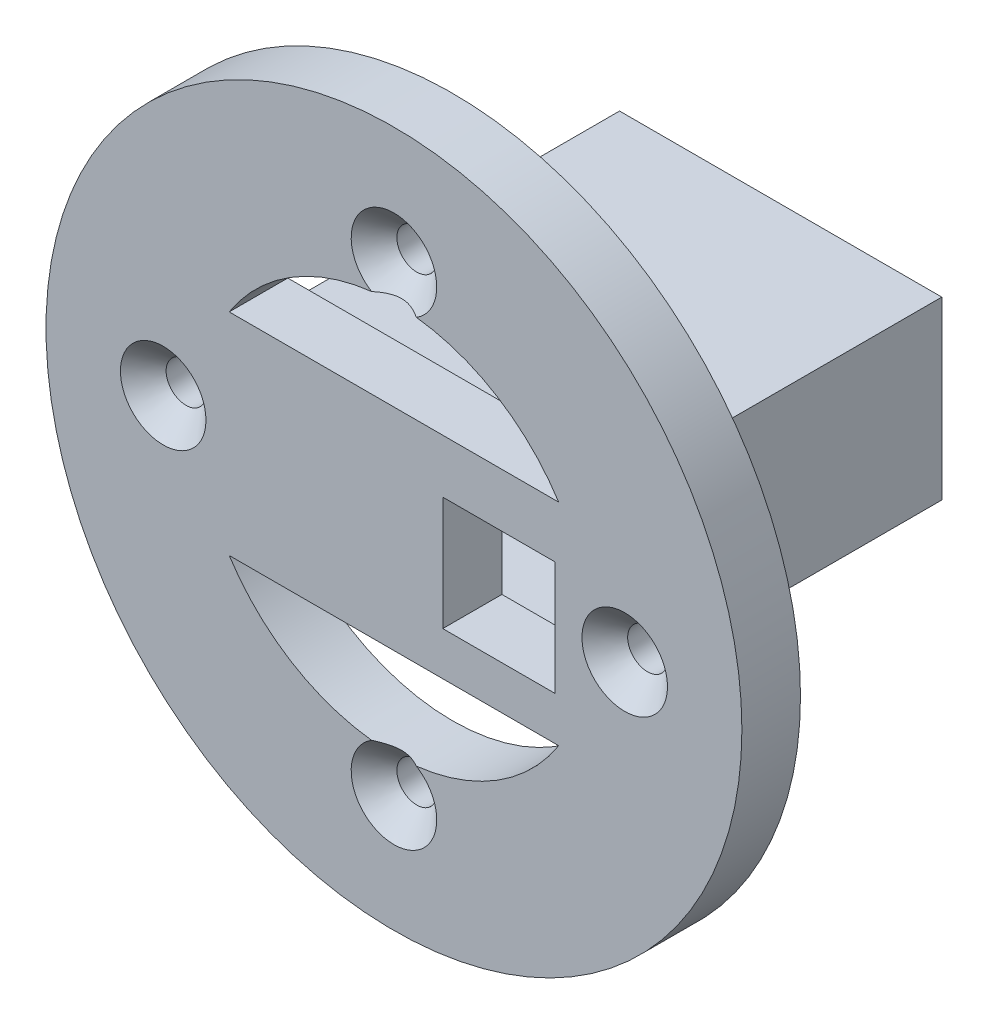
ISO-10303-21;
HEADER;
FILE_DESCRIPTION(('STEP AP214'),'2;1');
FILE_NAME('part.step','',(''),(''),'','','');
FILE_SCHEMA(('AUTOMOTIVE_DESIGN { 1 0 10303 214 1 1 1 1 }'));
ENDSEC;
DATA;
#1=APPLICATION_CONTEXT('core data for automotive mechanical design processes');
#2=APPLICATION_PROTOCOL_DEFINITION('international standard','automotive_design',2000,#1);
#3=PRODUCT_CONTEXT('',#1,'mechanical');
#4=PRODUCT('Part','Part','',(#3));
#5=PRODUCT_RELATED_PRODUCT_CATEGORY('part','',(#4));
#6=PRODUCT_DEFINITION_FORMATION('','',#4);
#7=PRODUCT_DEFINITION_CONTEXT('part definition',#1,'design');
#8=PRODUCT_DEFINITION('design','',#6,#7);
#9=PRODUCT_DEFINITION_SHAPE('','',#8);
#10=(LENGTH_UNIT() NAMED_UNIT(*) SI_UNIT(.MILLI.,.METRE.));
#11=(NAMED_UNIT(*) PLANE_ANGLE_UNIT() SI_UNIT($,.RADIAN.));
#12=(NAMED_UNIT(*) SI_UNIT($,.STERADIAN.) SOLID_ANGLE_UNIT());
#13=UNCERTAINTY_MEASURE_WITH_UNIT(LENGTH_MEASURE(1.E-05),#10,'distance_accuracy_value','');
#14=(GEOMETRIC_REPRESENTATION_CONTEXT(3) GLOBAL_UNCERTAINTY_ASSIGNED_CONTEXT((#13)) GLOBAL_UNIT_ASSIGNED_CONTEXT((#10,
#11,#12)) REPRESENTATION_CONTEXT('',''));
#15=CARTESIAN_POINT('',(0.,0.,0.));
#16=DIRECTION('',(0.,0.,1.));
#17=DIRECTION('',(1.,0.,0.));
#18=AXIS2_PLACEMENT_3D('',#15,#16,#17);
#19=CARTESIAN_POINT('',(13.75,7.5,0.));
#20=DIRECTION('',(-1.,0.,0.));
#21=DIRECTION('',(0.,0.,1.));
#22=AXIS2_PLACEMENT_3D('',#19,#20,#21);
#23=PLANE('',#22);
#24=DIRECTION('',(0.,0.,1.));
#25=VECTOR('',#24,1.);
#26=CARTESIAN_POINT('',(13.75,-5.29266234845059,-13.6995729837994));
#27=LINE('',#26,#25);
#28=CARTESIAN_POINT('',(13.75,-5.29266234845059,-0.050000000000005));
#29=VERTEX_POINT('',#28);
#30=CARTESIAN_POINT('',(13.75,-5.29266234845059,0.));
#31=VERTEX_POINT('',#30);
#32=EDGE_CURVE('E228',#29,#31,#27,.T.);
#33=ORIENTED_EDGE('',*,*,#32,.T.);
#34=DIRECTION('',(0.,-1.,0.));
#35=VECTOR('',#34,1.);
#36=CARTESIAN_POINT('',(13.75,7.5,0.));
#37=LINE('',#36,#35);
#38=CARTESIAN_POINT('',(13.75,-7.5,0.));
#39=VERTEX_POINT('',#38);
#40=EDGE_CURVE('E322',#31,#39,#37,.T.);
#41=ORIENTED_EDGE('',*,*,#40,.T.);
#42=DIRECTION('',(0.,0.,-1.));
#43=VECTOR('',#42,1.);
#44=CARTESIAN_POINT('',(13.75,-7.5,0.));
#45=LINE('',#44,#43);
#46=CARTESIAN_POINT('',(13.75,-7.5,-28.));
#47=VERTEX_POINT('',#46);
#48=EDGE_CURVE('E314',#39,#47,#45,.T.);
#49=ORIENTED_EDGE('',*,*,#48,.T.);
#50=DIRECTION('',(0.,-1.,0.));
#51=VECTOR('',#50,1.);
#52=CARTESIAN_POINT('',(13.75,7.5,-28.));
#53=LINE('',#52,#51);
#54=CARTESIAN_POINT('',(13.75,7.5,-28.));
#55=VERTEX_POINT('',#54);
#56=EDGE_CURVE('E319',#55,#47,#53,.T.);
#57=ORIENTED_EDGE('',*,*,#56,.F.);
#58=DIRECTION('',(0.,0.,-1.));
#59=VECTOR('',#58,1.);
#60=CARTESIAN_POINT('',(13.75,7.5,0.));
#61=LINE('',#60,#59);
#62=CARTESIAN_POINT('',(13.75,7.5,0.));
#63=VERTEX_POINT('',#62);
#64=EDGE_CURVE('E304',#63,#55,#61,.T.);
#65=ORIENTED_EDGE('',*,*,#64,.F.);
#66=CARTESIAN_POINT('',(13.75,4.42501278313102,0.));
#67=VERTEX_POINT('',#66);
#68=EDGE_CURVE('E323',#63,#67,#37,.T.);
#69=ORIENTED_EDGE('',*,*,#68,.T.);
#70=DIRECTION('',(0.,0.,1.));
#71=VECTOR('',#70,1.);
#72=CARTESIAN_POINT('',(13.75,4.42501278313102,-13.6995729837994));
#73=LINE('',#72,#71);
#74=CARTESIAN_POINT('',(13.75,4.42501278313102,-0.0500000000000049));
#75=VERTEX_POINT('',#74);
#76=EDGE_CURVE('E211',#75,#67,#73,.T.);
#77=ORIENTED_EDGE('',*,*,#76,.F.);
#78=DIRECTION('',(0.,-1.,0.));
#79=VECTOR('',#78,1.);
#80=CARTESIAN_POINT('',(13.75,-5.29266234845059,-0.0500000000000049));
#81=LINE('',#80,#79);
#82=EDGE_CURVE('E685',#75,#29,#81,.T.);
#83=ORIENTED_EDGE('',*,*,#82,.T.);
#84=EDGE_LOOP('',(#33,#41,#49,#57,#65,#69,#77,#83));
#85=FACE_BOUND('',#84,.T.);
#86=ADVANCED_FACE('F41',(#85),#23,.F.);
#87=CARTESIAN_POINT('',(-11.75,-6.1,-25.5));
#88=DIRECTION('',(0.,0.,1.));
#89=DIRECTION('',(1.,0.,0.));
#90=AXIS2_PLACEMENT_3D('',#87,#88,#89);
#91=PLANE('',#90);
#92=DIRECTION('',(0.,1.,0.));
#93=VECTOR('',#92,1.);
#94=CARTESIAN_POINT('',(11.75,-6.1,-25.5));
#95=LINE('',#94,#93);
#96=CARTESIAN_POINT('',(11.75,-6.1,-25.5));
#97=VERTEX_POINT('',#96);
#98=CARTESIAN_POINT('',(11.75,-5.5,-25.5));
#99=VERTEX_POINT('',#98);
#100=EDGE_CURVE('E292',#97,#99,#95,.T.);
#101=ORIENTED_EDGE('',*,*,#100,.T.);
#102=DIRECTION('',(-1.,0.,0.));
#103=VECTOR('',#102,1.);
#104=CARTESIAN_POINT('',(-11.75,-5.5,-25.5));
#105=LINE('',#104,#103);
#106=CARTESIAN_POINT('',(5.75000000000001,-5.5,-25.5));
#107=VERTEX_POINT('',#106);
#108=EDGE_CURVE('E261',#99,#107,#105,.T.);
#109=ORIENTED_EDGE('',*,*,#108,.T.);
#110=DIRECTION('',(0.,1.,0.));
#111=VECTOR('',#110,1.);
#112=CARTESIAN_POINT('',(5.75000000000001,-6.1,-25.5));
#113=LINE('',#112,#111);
#114=CARTESIAN_POINT('',(5.75000000000001,5.5,-25.5));
#115=VERTEX_POINT('',#114);
#116=EDGE_CURVE('E11',#107,#115,#113,.T.);
#117=ORIENTED_EDGE('',*,*,#116,.T.);
#118=DIRECTION('',(-1.,0.,0.));
#119=VECTOR('',#118,1.);
#120=CARTESIAN_POINT('',(-11.75,5.5,-25.5));
#121=LINE('',#120,#119);
#122=CARTESIAN_POINT('',(11.75,5.5,-25.5));
#123=VERTEX_POINT('',#122);
#124=EDGE_CURVE('E259',#123,#115,#121,.T.);
#125=ORIENTED_EDGE('',*,*,#124,.F.);
#126=CARTESIAN_POINT('',(11.75,6.1,-25.5));
#127=VERTEX_POINT('',#126);
#128=EDGE_CURVE('E295',#123,#127,#95,.T.);
#129=ORIENTED_EDGE('',*,*,#128,.T.);
#130=DIRECTION('',(1.,0.,0.));
#131=VECTOR('',#130,1.);
#132=CARTESIAN_POINT('',(-11.75,6.1,-25.5));
#133=LINE('',#132,#131);
#134=CARTESIAN_POINT('',(-11.75,6.1,-25.5));
#135=VERTEX_POINT('',#134);
#136=EDGE_CURVE('E282',#135,#127,#133,.T.);
#137=ORIENTED_EDGE('',*,*,#136,.F.);
#138=DIRECTION('',(0.,1.,0.));
#139=VECTOR('',#138,1.);
#140=CARTESIAN_POINT('',(-11.75,-6.1,-25.5));
#141=LINE('',#140,#139);
#142=CARTESIAN_POINT('',(-11.75,-6.1,-25.5));
#143=VERTEX_POINT('',#142);
#144=EDGE_CURVE('E289',#143,#135,#141,.T.);
#145=ORIENTED_EDGE('',*,*,#144,.F.);
#146=DIRECTION('',(1.,0.,0.));
#147=VECTOR('',#146,1.);
#148=CARTESIAN_POINT('',(-11.75,-6.1,-25.5));
#149=LINE('',#148,#147);
#150=EDGE_CURVE('E272',#143,#97,#149,.T.);
#151=ORIENTED_EDGE('',*,*,#150,.T.);
#152=EDGE_LOOP('',(#101,#109,#117,#125,#129,#137,#145,#151));
#153=FACE_BOUND('',#152,.T.);
#154=ADVANCED_FACE('F454',(#153),#91,.T.);
#155=CARTESIAN_POINT('',(-11.75,-6.1,-0.0500000000000036));
#156=DIRECTION('',(0.,0.,1.));
#157=DIRECTION('',(1.,0.,0.));
#158=AXIS2_PLACEMENT_3D('',#155,#156,#157);
#159=PLANE('',#158);
#160=DIRECTION('',(0.,-1.,0.));
#161=VECTOR('',#160,1.);
#162=CARTESIAN_POINT('',(4.16471791353497,-5.29266234845059,-0.0500000000000049));
#163=LINE('',#162,#161);
#164=CARTESIAN_POINT('',(4.16471791353497,4.42501278313102,-0.0500000000000049));
#165=VERTEX_POINT('',#164);
#166=CARTESIAN_POINT('',(4.16471791353497,-5.29266234845059,-0.0500000000000049));
#167=VERTEX_POINT('',#166);
#168=EDGE_CURVE('E208',#165,#167,#163,.T.);
#169=ORIENTED_EDGE('',*,*,#168,.T.);
#170=DIRECTION('',(1.,0.,0.));
#171=VECTOR('',#170,1.);
#172=CARTESIAN_POINT('',(13.75,-5.29266234845059,-0.0500000000000049));
#173=LINE('',#172,#171);
#174=CARTESIAN_POINT('',(11.75,-5.29266234845059,-0.0500000000000048));
#175=VERTEX_POINT('',#174);
#176=EDGE_CURVE('E678',#167,#175,#173,.T.);
#177=ORIENTED_EDGE('',*,*,#176,.T.);
#178=DIRECTION('',(0.,1.,0.));
#179=VECTOR('',#178,1.);
#180=CARTESIAN_POINT('',(11.75,-6.1,-0.0500000000000049));
#181=LINE('',#180,#179);
#182=CARTESIAN_POINT('',(11.75,-6.1,-0.0500000000000049));
#183=VERTEX_POINT('',#182);
#184=EDGE_CURVE('E296',#183,#175,#181,.T.);
#185=ORIENTED_EDGE('',*,*,#184,.F.);
#186=DIRECTION('',(1.,0.,0.));
#187=VECTOR('',#186,1.);
#188=CARTESIAN_POINT('',(-11.75,-6.1,-0.0500000000000036));
#189=LINE('',#188,#187);
#190=CARTESIAN_POINT('',(-11.75,-6.1,-0.0500000000000036));
#191=VERTEX_POINT('',#190);
#192=EDGE_CURVE('E265',#191,#183,#189,.T.);
#193=ORIENTED_EDGE('',*,*,#192,.F.);
#194=DIRECTION('',(0.,1.,0.));
#195=VECTOR('',#194,1.);
#196=CARTESIAN_POINT('',(-11.75,-6.1,-0.0500000000000036));
#197=LINE('',#196,#195);
#198=CARTESIAN_POINT('',(-11.75,6.1,-0.0500000000000036));
#199=VERTEX_POINT('',#198);
#200=EDGE_CURVE('E286',#191,#199,#197,.T.);
#201=ORIENTED_EDGE('',*,*,#200,.T.);
#202=DIRECTION('',(1.,0.,0.));
#203=VECTOR('',#202,1.);
#204=CARTESIAN_POINT('',(-11.75,6.1,-0.0500000000000036));
#205=LINE('',#204,#203);
#206=CARTESIAN_POINT('',(11.75,6.1,-0.0500000000000049));
#207=VERTEX_POINT('',#206);
#208=EDGE_CURVE('E264',#199,#207,#205,.T.);
#209=ORIENTED_EDGE('',*,*,#208,.T.);
#210=CARTESIAN_POINT('',(11.75,4.42501278313102,-0.0500000000000048));
#211=VERTEX_POINT('',#210);
#212=EDGE_CURVE('E276',#211,#207,#181,.T.);
#213=ORIENTED_EDGE('',*,*,#212,.F.);
#214=DIRECTION('',(1.,0.,0.));
#215=VECTOR('',#214,1.);
#216=CARTESIAN_POINT('',(13.75,4.42501278313102,-0.0500000000000049));
#217=LINE('',#216,#215);
#218=EDGE_CURVE('E234',#165,#211,#217,.T.);
#219=ORIENTED_EDGE('',*,*,#218,.F.);
#220=EDGE_LOOP('',(#169,#177,#185,#193,#201,#209,#213,#219));
#221=FACE_BOUND('',#220,.T.);
#222=ADVANCED_FACE('F462',(#221),#159,.F.);
#223=CARTESIAN_POINT('',(-11.75,-6.1,-0.0500000000000036));
#224=DIRECTION('',(1.,0.,0.));
#225=DIRECTION('',(0.,0.,-1.));
#226=AXIS2_PLACEMENT_3D('',#223,#224,#225);
#227=PLANE('',#226);
#228=DIRECTION('',(0.,0.,-1.));
#229=VECTOR('',#228,1.);
#230=CARTESIAN_POINT('',(-11.75,6.1,-0.0500000000000036));
#231=LINE('',#230,#229);
#232=EDGE_CURVE('E269',#199,#135,#231,.T.);
#233=ORIENTED_EDGE('',*,*,#232,.F.);
#234=ORIENTED_EDGE('',*,*,#200,.F.);
#235=DIRECTION('',(0.,0.,-1.));
#236=VECTOR('',#235,1.);
#237=CARTESIAN_POINT('',(-11.75,-6.1,-0.0500000000000036));
#238=LINE('',#237,#236);
#239=EDGE_CURVE('E274',#191,#143,#238,.T.);
#240=ORIENTED_EDGE('',*,*,#239,.T.);
#241=ORIENTED_EDGE('',*,*,#144,.T.);
#242=EDGE_LOOP('',(#233,#234,#240,#241));
#243=FACE_BOUND('',#242,.T.);
#244=ADVANCED_FACE('F527',(#243),#227,.T.);
#245=CARTESIAN_POINT('',(11.75,-6.1,-0.0500000000000049));
#246=DIRECTION('',(1.,0.,0.));
#247=DIRECTION('',(0.,0.,-1.));
#248=AXIS2_PLACEMENT_3D('',#245,#246,#247);
#249=PLANE('',#248);
#250=ORIENTED_EDGE('',*,*,#128,.F.);
#251=DIRECTION('',(0.,0.,-1.));
#252=VECTOR('',#251,1.);
#253=CARTESIAN_POINT('',(11.75,5.5,-25.));
#254=LINE('',#253,#252);
#255=CARTESIAN_POINT('',(11.75,5.5,-28.));
#256=VERTEX_POINT('',#255);
#257=EDGE_CURVE('E253',#123,#256,#254,.T.);
#258=ORIENTED_EDGE('',*,*,#257,.T.);
#259=DIRECTION('',(0.,-1.,0.));
#260=VECTOR('',#259,1.);
#261=CARTESIAN_POINT('',(11.75,5.5,-28.));
#262=LINE('',#261,#260);
#263=CARTESIAN_POINT('',(11.75,-5.5,-28.));
#264=VERTEX_POINT('',#263);
#265=EDGE_CURVE('E244',#256,#264,#262,.T.);
#266=ORIENTED_EDGE('',*,*,#265,.T.);
#267=DIRECTION('',(0.,0.,-1.));
#268=VECTOR('',#267,1.);
#269=CARTESIAN_POINT('',(11.75,-5.5,-25.));
#270=LINE('',#269,#268);
#271=EDGE_CURVE('E255',#99,#264,#270,.T.);
#272=ORIENTED_EDGE('',*,*,#271,.F.);
#273=ORIENTED_EDGE('',*,*,#100,.F.);
#274=DIRECTION('',(0.,0.,-1.));
#275=VECTOR('',#274,1.);
#276=CARTESIAN_POINT('',(11.75,-6.1,-0.0500000000000049));
#277=LINE('',#276,#275);
#278=EDGE_CURVE('E268',#183,#97,#277,.T.);
#279=ORIENTED_EDGE('',*,*,#278,.F.);
#280=ORIENTED_EDGE('',*,*,#184,.T.);
#281=EDGE_CURVE('E236',#175,#211,#181,.T.);
#282=ORIENTED_EDGE('',*,*,#281,.T.);
#283=ORIENTED_EDGE('',*,*,#212,.T.);
#284=DIRECTION('',(0.,0.,-1.));
#285=VECTOR('',#284,1.);
#286=CARTESIAN_POINT('',(11.75,6.1,-0.0500000000000049));
#287=LINE('',#286,#285);
#288=EDGE_CURVE('E279',#207,#127,#287,.T.);
#289=ORIENTED_EDGE('',*,*,#288,.T.);
#290=EDGE_LOOP('',(#250,#258,#266,#272,#273,#279,#280,#282,#283,#289));
#291=FACE_BOUND('',#290,.T.);
#292=ADVANCED_FACE('F531',(#291),#249,.F.);
#293=CARTESIAN_POINT('',(0.,-6.1,0.));
#294=DIRECTION('',(0.,1.,0.));
#295=DIRECTION('',(0.,0.,1.));
#296=AXIS2_PLACEMENT_3D('',#293,#294,#295);
#297=PLANE('',#296);
#298=ORIENTED_EDGE('',*,*,#192,.T.);
#299=ORIENTED_EDGE('',*,*,#278,.T.);
#300=ORIENTED_EDGE('',*,*,#150,.F.);
#301=ORIENTED_EDGE('',*,*,#239,.F.);
#302=EDGE_LOOP('',(#298,#299,#300,#301));
#303=FACE_BOUND('',#302,.T.);
#304=ADVANCED_FACE('F538',(#303),#297,.T.);
#305=CARTESIAN_POINT('',(0.,6.1,0.));
#306=DIRECTION('',(0.,1.,0.));
#307=DIRECTION('',(0.,0.,1.));
#308=AXIS2_PLACEMENT_3D('',#305,#306,#307);
#309=PLANE('',#308);
#310=ORIENTED_EDGE('',*,*,#208,.F.);
#311=ORIENTED_EDGE('',*,*,#232,.T.);
#312=ORIENTED_EDGE('',*,*,#136,.T.);
#313=ORIENTED_EDGE('',*,*,#288,.F.);
#314=EDGE_LOOP('',(#310,#311,#312,#313));
#315=FACE_BOUND('',#314,.T.);
#316=ADVANCED_FACE('F542',(#315),#309,.F.);
#317=CARTESIAN_POINT('',(5.75000000000001,5.5,-25.));
#318=DIRECTION('',(1.,0.,0.));
#319=DIRECTION('',(0.,1.,0.));
#320=AXIS2_PLACEMENT_3D('',#317,#318,#319);
#321=PLANE('',#320);
#322=DIRECTION('',(0.,0.,-1.));
#323=VECTOR('',#322,1.);
#324=CARTESIAN_POINT('',(5.75000000000001,-5.5,-25.));
#325=LINE('',#324,#323);
#326=CARTESIAN_POINT('',(5.75000000000001,-5.5,-28.));
#327=VERTEX_POINT('',#326);
#328=EDGE_CURVE('E257',#107,#327,#325,.T.);
#329=ORIENTED_EDGE('',*,*,#328,.T.);
#330=DIRECTION('',(0.,-1.,0.));
#331=VECTOR('',#330,1.);
#332=CARTESIAN_POINT('',(5.75000000000001,5.5,-28.));
#333=LINE('',#332,#331);
#334=CARTESIAN_POINT('',(5.75000000000001,5.5,-28.));
#335=VERTEX_POINT('',#334);
#336=EDGE_CURVE('E238',#335,#327,#333,.T.);
#337=ORIENTED_EDGE('',*,*,#336,.F.);
#338=DIRECTION('',(0.,0.,-1.));
#339=VECTOR('',#338,1.);
#340=CARTESIAN_POINT('',(5.75000000000001,5.5,-25.));
#341=LINE('',#340,#339);
#342=EDGE_CURVE('E250',#115,#335,#341,.T.);
#343=ORIENTED_EDGE('',*,*,#342,.F.);
#344=ORIENTED_EDGE('',*,*,#116,.F.);
#345=EDGE_LOOP('',(#329,#337,#343,#344));
#346=FACE_BOUND('',#345,.T.);
#347=ADVANCED_FACE('F550',(#346),#321,.T.);
#348=CARTESIAN_POINT('',(5.75000000000001,-5.5,-25.));
#349=DIRECTION('',(0.,1.,0.));
#350=DIRECTION('',(-1.,0.,0.));
#351=AXIS2_PLACEMENT_3D('',#348,#349,#350);
#352=PLANE('',#351);
#353=ORIENTED_EDGE('',*,*,#271,.T.);
#354=DIRECTION('',(1.,0.,0.));
#355=VECTOR('',#354,1.);
#356=CARTESIAN_POINT('',(5.75000000000001,-5.5,-28.));
#357=LINE('',#356,#355);
#358=EDGE_CURVE('E241',#327,#264,#357,.T.);
#359=ORIENTED_EDGE('',*,*,#358,.F.);
#360=ORIENTED_EDGE('',*,*,#328,.F.);
#361=ORIENTED_EDGE('',*,*,#108,.F.);
#362=EDGE_LOOP('',(#353,#359,#360,#361));
#363=FACE_BOUND('',#362,.T.);
#364=ADVANCED_FACE('F565',(#363),#352,.T.);
#365=CARTESIAN_POINT('',(5.75000000000001,5.5,-25.));
#366=DIRECTION('',(0.,1.,0.));
#367=DIRECTION('',(-1.,0.,0.));
#368=AXIS2_PLACEMENT_3D('',#365,#366,#367);
#369=PLANE('',#368);
#370=ORIENTED_EDGE('',*,*,#124,.T.);
#371=ORIENTED_EDGE('',*,*,#342,.T.);
#372=DIRECTION('',(1.,0.,0.));
#373=VECTOR('',#372,1.);
#374=CARTESIAN_POINT('',(5.75000000000001,5.5,-28.));
#375=LINE('',#374,#373);
#376=EDGE_CURVE('E247',#335,#256,#375,.T.);
#377=ORIENTED_EDGE('',*,*,#376,.T.);
#378=ORIENTED_EDGE('',*,*,#257,.F.);
#379=EDGE_LOOP('',(#370,#371,#377,#378));
#380=FACE_BOUND('',#379,.T.);
#381=ADVANCED_FACE('F575',(#380),#369,.F.);
#382=CARTESIAN_POINT('',(-13.75,7.5,-28.));
#383=DIRECTION('',(0.,0.,1.));
#384=DIRECTION('',(1.,0.,0.));
#385=AXIS2_PLACEMENT_3D('',#382,#383,#384);
#386=PLANE('',#385);
#387=DIRECTION('',(-1.,0.,0.));
#388=VECTOR('',#387,1.);
#389=CARTESIAN_POINT('',(-13.75,-7.5,-28.));
#390=LINE('',#389,#388);
#391=CARTESIAN_POINT('',(-13.75,-7.5,-28.));
#392=VERTEX_POINT('',#391);
#393=EDGE_CURVE('E302',#47,#392,#390,.T.);
#394=ORIENTED_EDGE('',*,*,#393,.T.);
#395=DIRECTION('',(0.,-1.,0.));
#396=VECTOR('',#395,1.);
#397=CARTESIAN_POINT('',(-13.75,7.5,-28.));
#398=LINE('',#397,#396);
#399=CARTESIAN_POINT('',(-13.75,7.5,-28.));
#400=VERTEX_POINT('',#399);
#401=EDGE_CURVE('E308',#400,#392,#398,.T.);
#402=ORIENTED_EDGE('',*,*,#401,.F.);
#403=DIRECTION('',(-1.,0.,0.));
#404=VECTOR('',#403,1.);
#405=CARTESIAN_POINT('',(-13.75,7.5,-28.));
#406=LINE('',#405,#404);
#407=EDGE_CURVE('E306',#55,#400,#406,.T.);
#408=ORIENTED_EDGE('',*,*,#407,.F.);
#409=ORIENTED_EDGE('',*,*,#56,.T.);
#410=EDGE_LOOP('',(#394,#402,#408,#409));
#411=FACE_BOUND('',#410,.T.);
#412=ORIENTED_EDGE('',*,*,#336,.T.);
#413=ORIENTED_EDGE('',*,*,#358,.T.);
#414=ORIENTED_EDGE('',*,*,#265,.F.);
#415=ORIENTED_EDGE('',*,*,#376,.F.);
#416=EDGE_LOOP('',(#412,#413,#414,#415));
#417=FACE_BOUND('',#416,.T.);
#418=ADVANCED_FACE('F442',(#411,#417),#386,.F.);
#419=CARTESIAN_POINT('',(0.,0.,0.));
#420=DIRECTION('',(0.,0.,1.));
#421=DIRECTION('',(1.,0.,0.));
#422=AXIS2_PLACEMENT_3D('',#419,#420,#421);
#423=PLANE('',#422);
#424=CARTESIAN_POINT('',(0.,0.,0.));
#425=DIRECTION('',(0.,0.,1.));
#426=DIRECTION('',(1.,0.,0.));
#427=AXIS2_PLACEMENT_3D('',#424,#425,#426);
#428=CIRCLE('',#427,29.6925271830558);
#429=CARTESIAN_POINT('',(29.6925271830558,0.,0.));
#430=VERTEX_POINT('',#429);
#431=EDGE_CURVE('E382',#430,#430,#428,.T.);
#432=ORIENTED_EDGE('',*,*,#431,.F.);
#433=EDGE_LOOP('',(#432));
#434=FACE_BOUND('',#433,.T.);
#435=DIRECTION('',(-1.,0.,0.));
#436=VECTOR('',#435,1.);
#437=CARTESIAN_POINT('',(0.,9.,0.));
#438=LINE('',#437,#436);
#439=CARTESIAN_POINT('',(14.058465910513,9.,0.));
#440=VERTEX_POINT('',#439);
#441=CARTESIAN_POINT('',(-14.058465910513,9.,0.));
#442=VERTEX_POINT('',#441);
#443=EDGE_CURVE('E379',#440,#442,#438,.T.);
#444=ORIENTED_EDGE('',*,*,#443,.F.);
#445=CARTESIAN_POINT('',(0.,0.,0.));
#446=DIRECTION('',(0.,0.,1.));
#447=DIRECTION('',(1.,0.,0.));
#448=AXIS2_PLACEMENT_3D('',#445,#446,#447);
#449=CIRCLE('',#448,16.6925271830558);
#450=EDGE_CURVE('E376',#440,#442,#449,.T.);
#451=ORIENTED_EDGE('',*,*,#450,.T.);
#452=EDGE_LOOP('',(#444,#451));
#453=FACE_BOUND('',#452,.T.);
#454=CARTESIAN_POINT('',(-14.058465910513,-9.,0.));
#455=VERTEX_POINT('',#454);
#456=CARTESIAN_POINT('',(14.058465910513,-9.,0.));
#457=VERTEX_POINT('',#456);
#458=EDGE_CURVE('E372',#455,#457,#449,.T.);
#459=ORIENTED_EDGE('',*,*,#458,.T.);
#460=DIRECTION('',(-1.,0.,0.));
#461=VECTOR('',#460,1.);
#462=CARTESIAN_POINT('',(0.,-9.,0.));
#463=LINE('',#462,#461);
#464=EDGE_CURVE('E375',#457,#455,#463,.T.);
#465=ORIENTED_EDGE('',*,*,#464,.T.);
#466=EDGE_LOOP('',(#459,#465));
#467=FACE_BOUND('',#466,.T.);
#468=CARTESIAN_POINT('',(-19.6925271830558,0.,0.));
#469=DIRECTION('',(0.,0.,1.));
#470=DIRECTION('',(1.,0.,0.));
#471=AXIS2_PLACEMENT_3D('',#468,#469,#470);
#472=CIRCLE('',#471,1.69999999999999);
#473=CARTESIAN_POINT('',(-17.9925271830558,0.,0.));
#474=VERTEX_POINT('',#473);
#475=EDGE_CURVE('E355',#474,#474,#472,.T.);
#476=ORIENTED_EDGE('',*,*,#475,.T.);
#477=EDGE_LOOP('',(#476));
#478=FACE_BOUND('',#477,.T.);
#479=CARTESIAN_POINT('',(19.6925271830558,0.,0.));
#480=DIRECTION('',(0.,0.,1.));
#481=DIRECTION('',(1.,0.,0.));
#482=AXIS2_PLACEMENT_3D('',#479,#480,#481);
#483=CIRCLE('',#482,1.69999999999999);
#484=CARTESIAN_POINT('',(21.3925271830558,0.,0.));
#485=VERTEX_POINT('',#484);
#486=EDGE_CURVE('E348',#485,#485,#483,.T.);
#487=ORIENTED_EDGE('',*,*,#486,.T.);
#488=EDGE_LOOP('',(#487));
#489=FACE_BOUND('',#488,.T.);
#490=CARTESIAN_POINT('',(0.,-19.6925271830558,0.));
#491=DIRECTION('',(0.,0.,1.));
#492=DIRECTION('',(1.,0.,0.));
#493=AXIS2_PLACEMENT_3D('',#490,#491,#492);
#494=CIRCLE('',#493,1.69999999999999);
#495=CARTESIAN_POINT('',(1.69999999999999,-19.6925271830558,0.));
#496=VERTEX_POINT('',#495);
#497=EDGE_CURVE('E341',#496,#496,#494,.T.);
#498=ORIENTED_EDGE('',*,*,#497,.T.);
#499=EDGE_LOOP('',(#498));
#500=FACE_BOUND('',#499,.T.);
#501=CARTESIAN_POINT('',(0.,19.6925271830558,0.));
#502=DIRECTION('',(0.,0.,1.));
#503=DIRECTION('',(1.,0.,0.));
#504=AXIS2_PLACEMENT_3D('',#501,#502,#503);
#505=CIRCLE('',#504,1.69999999999999);
#506=CARTESIAN_POINT('',(1.69999999999999,19.6925271830558,0.));
#507=VERTEX_POINT('',#506);
#508=EDGE_CURVE('E335',#507,#507,#505,.T.);
#509=ORIENTED_EDGE('',*,*,#508,.T.);
#510=EDGE_LOOP('',(#509));
#511=FACE_BOUND('',#510,.T.);
#512=DIRECTION('',(1.,0.,0.));
#513=VECTOR('',#512,1.);
#514=CARTESIAN_POINT('',(-13.75,7.5,0.));
#515=LINE('',#514,#513);
#516=CARTESIAN_POINT('',(-13.75,7.5,0.));
#517=VERTEX_POINT('',#516);
#518=EDGE_CURVE('E301',#517,#63,#515,.T.);
#519=ORIENTED_EDGE('',*,*,#518,.F.);
#520=DIRECTION('',(0.,-1.,0.));
#521=VECTOR('',#520,1.);
#522=CARTESIAN_POINT('',(-13.75,7.5,0.));
#523=LINE('',#522,#521);
#524=CARTESIAN_POINT('',(-13.75,-7.5,0.));
#525=VERTEX_POINT('',#524);
#526=EDGE_CURVE('E326',#517,#525,#523,.T.);
#527=ORIENTED_EDGE('',*,*,#526,.T.);
#528=DIRECTION('',(1.,0.,0.));
#529=VECTOR('',#528,1.);
#530=CARTESIAN_POINT('',(-13.75,-7.5,0.));
#531=LINE('',#530,#529);
#532=EDGE_CURVE('E311',#525,#39,#531,.T.);
#533=ORIENTED_EDGE('',*,*,#532,.T.);
#534=ORIENTED_EDGE('',*,*,#40,.F.);
#535=EDGE_CURVE('E327',#67,#31,#37,.T.);
#536=ORIENTED_EDGE('',*,*,#535,.F.);
#537=ORIENTED_EDGE('',*,*,#68,.F.);
#538=EDGE_LOOP('',(#519,#527,#533,#534,#536,#537));
#539=FACE_BOUND('',#538,.T.);
#540=ADVANCED_FACE('F439',(#434,#453,#467,#478,#489,#500,#511,#539),#423,.F.);
#541=CARTESIAN_POINT('',(0.,9.,5.));
#542=DIRECTION('',(0.,-1.,0.));
#543=DIRECTION('',(0.,0.,-1.));
#544=AXIS2_PLACEMENT_3D('',#541,#542,#543);
#545=PLANE('',#544);
#546=ORIENTED_EDGE('',*,*,#443,.T.);
#547=DIRECTION('',(0.,0.,-1.));
#548=VECTOR('',#547,1.);
#549=CARTESIAN_POINT('',(-14.058465910513,9.,5.));
#550=LINE('',#549,#548);
#551=CARTESIAN_POINT('',(-14.058465910513,9.,5.));
#552=VERTEX_POINT('',#551);
#553=EDGE_CURVE('E387',#552,#442,#550,.T.);
#554=ORIENTED_EDGE('',*,*,#553,.F.);
#555=DIRECTION('',(-1.,0.,0.));
#556=VECTOR('',#555,1.);
#557=CARTESIAN_POINT('',(0.,9.,5.));
#558=LINE('',#557,#556);
#559=CARTESIAN_POINT('',(14.058465910513,9.,5.));
#560=VERTEX_POINT('',#559);
#561=EDGE_CURVE('E365',#560,#552,#558,.T.);
#562=ORIENTED_EDGE('',*,*,#561,.F.);
#563=DIRECTION('',(0.,0.,-1.));
#564=VECTOR('',#563,1.);
#565=CARTESIAN_POINT('',(14.058465910513,9.,5.));
#566=LINE('',#565,#564);
#567=EDGE_CURVE('E385',#560,#440,#566,.T.);
#568=ORIENTED_EDGE('',*,*,#567,.T.);
#569=EDGE_LOOP('',(#546,#554,#562,#568));
#570=FACE_BOUND('',#569,.T.);
#571=ADVANCED_FACE('F441',(#570),#545,.F.);
#572=CARTESIAN_POINT('',(0.,0.,5.));
#573=DIRECTION('',(0.,0.,-1.));
#574=DIRECTION('',(-1.,0.,0.));
#575=AXIS2_PLACEMENT_3D('',#572,#573,#574);
#576=CYLINDRICAL_SURFACE('',#575,16.6925271830558);
#577=CARTESIAN_POINT('',(1.9113309362851,-16.5827403588507,5.0002));
#578=CARTESIAN_POINT('',(1.81686091365663,-16.5936233985878,4.94152334581964));
#579=CARTESIAN_POINT('',(1.72097131663075,-16.6038629712685,4.88482921939005));
#580=CARTESIAN_POINT('',(1.52556110971891,-16.6229617781007,4.77676281096836));
#581=CARTESIAN_POINT('',(1.42602624929648,-16.6318146715409,4.72541531579648));
#582=CARTESIAN_POINT('',(1.2216407447067,-16.6480849234389,4.62913605478863));
#583=CARTESIAN_POINT('',(1.11672842084012,-16.6554752499797,4.58432852166578));
#584=CARTESIAN_POINT('',(0.903231739312138,-16.668414320142,4.50456477989861));
#585=CARTESIAN_POINT('',(0.794654260729575,-16.6739663230564,4.46959115282122));
#586=CARTESIAN_POINT('',(0.611308854022554,-16.6814904742954,4.42165237342302));
#587=CARTESIAN_POINT('',(0.537464015795007,-16.6840385557379,4.40524172781665));
#588=CARTESIAN_POINT('',(0.388631656706367,-16.6881684709717,4.3785059922727));
#589=CARTESIAN_POINT('',(0.313644093229509,-16.6897502686365,4.36818112986539));
#590=CARTESIAN_POINT('',(0.163685777336899,-16.6918915673055,4.35417765702953));
#591=CARTESIAN_POINT('',(0.0887205248400714,-16.6924598196453,4.35044215468568));
#592=CARTESIAN_POINT('',(-0.0612444520779552,-16.6925832399892,4.3496320625571));
#593=CARTESIAN_POINT('',(-0.136244175175964,-16.6921384440834,4.35255723548427));
#594=CARTESIAN_POINT('',(-0.285531855767723,-16.6902515247844,4.36490692027941));
#595=CARTESIAN_POINT('',(-0.359820967616176,-16.6888114736635,4.37431792754207));
#596=CARTESIAN_POINT('',(-0.507369937665457,-16.6849781668815,4.39917560226524));
#597=CARTESIAN_POINT('',(-0.580629278009705,-16.6825844482234,4.41462520133997));
#598=CARTESIAN_POINT('',(-0.799412123210853,-16.6740151973533,4.46936341528069));
#599=CARTESIAN_POINT('',(-0.942850273604918,-16.666466628122,4.51693601414778));
#600=CARTESIAN_POINT('',(-1.15581328323095,-16.6526256802617,4.60151731772038));
#601=CARTESIAN_POINT('',(-1.22788865339923,-16.6474582033497,4.63270227483922));
#602=CARTESIAN_POINT('',(-1.37031648959177,-16.6363394324341,4.69873826684077));
#603=CARTESIAN_POINT('',(-1.44066853782495,-16.6303879505487,4.73359018008203));
#604=CARTESIAN_POINT('',(-1.57859723388737,-16.6178584729172,4.80573558759817));
#605=CARTESIAN_POINT('',(-1.64620025422261,-16.6112919881478,4.84298125479279));
#606=CARTESIAN_POINT('',(-1.77986779505782,-16.5975007148304,4.91988999886459));
#607=CARTESIAN_POINT('',(-1.84593368283373,-16.5902765417837,4.95955080423973));
#608=CARTESIAN_POINT('',(-1.9113309362851,-16.5827403588507,5.0002));
#609=B_SPLINE_CURVE_WITH_KNOTS('',3,(#577,#578,#579,#580,#581,#582,#583,#584,#585,#586,#587,
#588,#589,#590,#591,#592,#593,#594,#595,#596,#597,#598,#599,#600,#601,#602,#603,#604,#605,#606,
#607,#608),.UNSPECIFIED.,.F.,.F.,(4,2,2,2,2,2,2,2,2,2,2,2,2,2,2,4),(0.,0.335340175629545,
0.672171574818139,1.01474255400468,1.35670287163246,1.58354538539434,1.81039637962052,
2.035278996569,2.26015360214772,2.48456138977357,2.7090782584331,3.16136186214135,
3.39740583511212,3.63350647778132,3.86584015587305,4.09795859548117),.UNSPECIFIED.);
#610=CARTESIAN_POINT('',(1.91100928095911,-16.5827774297656,5.));
#611=VERTEX_POINT('',#610);
#612=CARTESIAN_POINT('',(-1.9110092809591,-16.5827774297656,5.));
#613=VERTEX_POINT('',#612);
#614=EDGE_CURVE('E390',#611,#613,#609,.T.);
#615=ORIENTED_EDGE('',*,*,#614,.F.);
#616=CARTESIAN_POINT('',(0.,0.,5.));
#617=DIRECTION('',(0.,0.,1.));
#618=DIRECTION('',(1.,0.,0.));
#619=AXIS2_PLACEMENT_3D('',#616,#617,#618);
#620=CIRCLE('',#619,16.6925271830558);
#621=CARTESIAN_POINT('',(14.058465910513,-9.,5.));
#622=VERTEX_POINT('',#621);
#623=EDGE_CURVE('E360',#611,#622,#620,.T.);
#624=ORIENTED_EDGE('',*,*,#623,.T.);
#625=DIRECTION('',(0.,0.,-1.));
#626=VECTOR('',#625,1.);
#627=CARTESIAN_POINT('',(14.058465910513,-9.,5.));
#628=LINE('',#627,#626);
#629=EDGE_CURVE('E371',#622,#457,#628,.T.);
#630=ORIENTED_EDGE('',*,*,#629,.T.);
#631=ORIENTED_EDGE('',*,*,#458,.F.);
#632=DIRECTION('',(0.,0.,-1.));
#633=VECTOR('',#632,1.);
#634=CARTESIAN_POINT('',(-14.058465910513,-9.,5.));
#635=LINE('',#634,#633);
#636=CARTESIAN_POINT('',(-14.058465910513,-9.,5.));
#637=VERTEX_POINT('',#636);
#638=EDGE_CURVE('E388',#637,#455,#635,.T.);
#639=ORIENTED_EDGE('',*,*,#638,.F.);
#640=EDGE_CURVE('E356',#637,#613,#620,.T.);
#641=ORIENTED_EDGE('',*,*,#640,.T.);
#642=EDGE_LOOP('',(#615,#624,#630,#631,#639,#641));
#643=FACE_BOUND('',#642,.T.);
#644=ADVANCED_FACE('F776',(#643),#576,.F.);
#645=CARTESIAN_POINT('',(-1.9113309362851,16.5827403588507,5.0002));
#646=CARTESIAN_POINT('',(-1.81686091365664,16.5936233985878,4.94152334581964));
#647=CARTESIAN_POINT('',(-1.72097131663076,16.6038629712685,4.88482921939005));
#648=CARTESIAN_POINT('',(-1.52556110971892,16.6229617781007,4.77676281096836));
#649=CARTESIAN_POINT('',(-1.42602624929648,16.6318146715409,4.72541531579648));
#650=CARTESIAN_POINT('',(-1.2216407447067,16.6480849234389,4.62913605478863));
#651=CARTESIAN_POINT('',(-1.11672842084012,16.6554752499797,4.58432852166578));
#652=CARTESIAN_POINT('',(-0.903231739312143,16.668414320142,4.50456477989862));
#653=CARTESIAN_POINT('',(-0.79465426072958,16.6739663230564,4.46959115282122));
#654=CARTESIAN_POINT('',(-0.611308854022559,16.6814904742954,4.42165237342302));
#655=CARTESIAN_POINT('',(-0.537464015795012,16.6840385557379,4.40524172781665));
#656=CARTESIAN_POINT('',(-0.388631656706372,16.6881684709717,4.3785059922727));
#657=CARTESIAN_POINT('',(-0.313644093229513,16.6897502686365,4.36818112986539));
#658=CARTESIAN_POINT('',(-0.163685777336904,16.6918915673055,4.35417765702953));
#659=CARTESIAN_POINT('',(-0.0887205248400762,16.6924598196453,4.35044215468568));
#660=CARTESIAN_POINT('',(0.0612444520779505,16.6925832399892,4.3496320625571));
#661=CARTESIAN_POINT('',(0.136244175175959,16.6921384440834,4.35255723548427));
#662=CARTESIAN_POINT('',(0.285531855767718,16.6902515247844,4.36490692027941));
#663=CARTESIAN_POINT('',(0.359820967616171,16.6888114736635,4.37431792754207));
#664=CARTESIAN_POINT('',(0.507369937665452,16.6849781668815,4.39917560226524));
#665=CARTESIAN_POINT('',(0.580629278009701,16.6825844482234,4.41462520133997));
#666=CARTESIAN_POINT('',(0.799412123210848,16.6740151973533,4.46936341528069));
#667=CARTESIAN_POINT('',(0.942850273604913,16.666466628122,4.51693601414778));
#668=CARTESIAN_POINT('',(1.15581328323094,16.6526256802617,4.60151731772038));
#669=CARTESIAN_POINT('',(1.22788865339923,16.6474582033497,4.63270227483922));
#670=CARTESIAN_POINT('',(1.37031648959177,16.6363394324341,4.69873826684077));
#671=CARTESIAN_POINT('',(1.44066853782495,16.6303879505487,4.73359018008203));
#672=CARTESIAN_POINT('',(1.57859723388736,16.6178584729172,4.80573558759817));
#673=CARTESIAN_POINT('',(1.6462002542226,16.6112919881478,4.84298125479279));
#674=CARTESIAN_POINT('',(1.77986779505781,16.5975007148304,4.91988999886459));
#675=CARTESIAN_POINT('',(1.84593368283373,16.5902765417837,4.95955080423973));
#676=CARTESIAN_POINT('',(1.9113309362851,16.5827403588507,5.0002));
#677=B_SPLINE_CURVE_WITH_KNOTS('',3,(#645,#646,#647,#648,#649,#650,#651,#652,#653,#654,#655,
#656,#657,#658,#659,#660,#661,#662,#663,#664,#665,#666,#667,#668,#669,#670,#671,#672,#673,#674,
#675,#676),.UNSPECIFIED.,.F.,.F.,(4,2,2,2,2,2,2,2,2,2,2,2,2,2,2,4),(0.,0.335340175629546,
0.672171574818139,1.01474255400468,1.35670287163246,1.58354538539434,1.81039637962052,
2.03527899656901,2.26015360214772,2.48456138977357,2.7090782584331,3.16136186214135,
3.39740583511213,3.63350647778132,3.86584015587305,4.09795859548116),.UNSPECIFIED.);
#678=CARTESIAN_POINT('',(-1.91100928095911,16.5827774297656,5.));
#679=VERTEX_POINT('',#678);
#680=CARTESIAN_POINT('',(1.9110092809591,16.5827774297656,5.));
#681=VERTEX_POINT('',#680);
#682=EDGE_CURVE('E49',#679,#681,#677,.T.);
#683=ORIENTED_EDGE('',*,*,#682,.F.);
#684=EDGE_CURVE('E361',#679,#552,#620,.T.);
#685=ORIENTED_EDGE('',*,*,#684,.T.);
#686=ORIENTED_EDGE('',*,*,#553,.T.);
#687=ORIENTED_EDGE('',*,*,#450,.F.);
#688=ORIENTED_EDGE('',*,*,#567,.F.);
#689=EDGE_CURVE('E362',#560,#681,#620,.T.);
#690=ORIENTED_EDGE('',*,*,#689,.T.);
#691=EDGE_LOOP('',(#683,#685,#686,#687,#688,#690));
#692=FACE_BOUND('',#691,.T.);
#693=ADVANCED_FACE('F405',(#692),#576,.F.);
#694=CARTESIAN_POINT('',(0.,-9.,5.));
#695=DIRECTION('',(0.,-1.,0.));
#696=DIRECTION('',(0.,0.,-1.));
#697=AXIS2_PLACEMENT_3D('',#694,#695,#696);
#698=PLANE('',#697);
#699=ORIENTED_EDGE('',*,*,#464,.F.);
#700=ORIENTED_EDGE('',*,*,#629,.F.);
#701=DIRECTION('',(-1.,0.,0.));
#702=VECTOR('',#701,1.);
#703=CARTESIAN_POINT('',(0.,-9.,5.));
#704=LINE('',#703,#702);
#705=EDGE_CURVE('E359',#622,#637,#704,.T.);
#706=ORIENTED_EDGE('',*,*,#705,.T.);
#707=ORIENTED_EDGE('',*,*,#638,.T.);
#708=EDGE_LOOP('',(#699,#700,#706,#707));
#709=FACE_BOUND('',#708,.T.);
#710=ADVANCED_FACE('F43',(#709),#698,.T.);
#711=CARTESIAN_POINT('',(0.,0.,5.));
#712=DIRECTION('',(0.,0.,-1.));
#713=DIRECTION('',(-1.,0.,0.));
#714=AXIS2_PLACEMENT_3D('',#711,#712,#713);
#715=CYLINDRICAL_SURFACE('',#714,29.6925271830558);
#716=CARTESIAN_POINT('',(0.,0.,5.));
#717=DIRECTION('',(0.,0.,1.));
#718=DIRECTION('',(1.,0.,0.));
#719=AXIS2_PLACEMENT_3D('',#716,#717,#718);
#720=CIRCLE('',#719,29.6925271830558);
#721=CARTESIAN_POINT('',(29.6925271830558,0.,5.));
#722=VERTEX_POINT('',#721);
#723=EDGE_CURVE('E368',#722,#722,#720,.T.);
#724=ORIENTED_EDGE('',*,*,#723,.F.);
#725=EDGE_LOOP('',(#724));
#726=FACE_BOUND('',#725,.T.);
#727=ORIENTED_EDGE('',*,*,#431,.T.);
#728=EDGE_LOOP('',(#727));
#729=FACE_BOUND('',#728,.T.);
#730=ADVANCED_FACE('F438',(#726,#729),#715,.T.);
#731=CARTESIAN_POINT('',(0.,0.,5.));
#732=DIRECTION('',(0.,0.,1.));
#733=DIRECTION('',(1.,0.,0.));
#734=AXIS2_PLACEMENT_3D('',#731,#732,#733);
#735=PLANE('',#734);
#736=DIRECTION('',(0.,1.,0.));
#737=VECTOR('',#736,1.);
#738=CARTESIAN_POINT('',(13.75,-5.29266234845059,5.));
#739=LINE('',#738,#737);
#740=CARTESIAN_POINT('',(13.75,-5.29266234845059,5.));
#741=VERTEX_POINT('',#740);
#742=CARTESIAN_POINT('',(13.75,4.42501278313102,5.));
#743=VERTEX_POINT('',#742);
#744=EDGE_CURVE('E64',#741,#743,#739,.T.);
#745=ORIENTED_EDGE('',*,*,#744,.F.);
#746=DIRECTION('',(-1.,0.,0.));
#747=VECTOR('',#746,1.);
#748=CARTESIAN_POINT('',(13.75,-5.29266234845059,5.));
#749=LINE('',#748,#747);
#750=CARTESIAN_POINT('',(4.16471791353497,-5.29266234845059,5.));
#751=VERTEX_POINT('',#750);
#752=EDGE_CURVE('E223',#741,#751,#749,.T.);
#753=ORIENTED_EDGE('',*,*,#752,.T.);
#754=DIRECTION('',(0.,1.,0.));
#755=VECTOR('',#754,1.);
#756=CARTESIAN_POINT('',(4.16471791353497,-5.29266234845059,5.));
#757=LINE('',#756,#755);
#758=CARTESIAN_POINT('',(4.16471791353497,4.42501278313102,5.));
#759=VERTEX_POINT('',#758);
#760=EDGE_CURVE('E205',#751,#759,#757,.T.);
#761=ORIENTED_EDGE('',*,*,#760,.T.);
#762=DIRECTION('',(-1.,0.,0.));
#763=VECTOR('',#762,1.);
#764=CARTESIAN_POINT('',(13.75,4.42501278313102,5.));
#765=LINE('',#764,#763);
#766=EDGE_CURVE('E214',#743,#759,#765,.T.);
#767=ORIENTED_EDGE('',*,*,#766,.F.);
#768=EDGE_LOOP('',(#745,#753,#761,#767));
#769=FACE_BOUND('',#768,.T.);
#770=CARTESIAN_POINT('',(0.,19.6925271830558,5.));
#771=DIRECTION('',(0.,0.,1.));
#772=DIRECTION('',(1.,0.,0.));
#773=AXIS2_PLACEMENT_3D('',#770,#771,#772);
#774=CIRCLE('',#773,3.65);
#775=EDGE_CURVE('E330',#681,#679,#774,.T.);
#776=ORIENTED_EDGE('',*,*,#775,.F.);
#777=ORIENTED_EDGE('',*,*,#689,.F.);
#778=ORIENTED_EDGE('',*,*,#561,.T.);
#779=ORIENTED_EDGE('',*,*,#684,.F.);
#780=EDGE_LOOP('',(#776,#777,#778,#779));
#781=FACE_BOUND('',#780,.T.);
#782=CARTESIAN_POINT('',(0.,-19.6925271830558,5.));
#783=DIRECTION('',(0.,0.,1.));
#784=DIRECTION('',(1.,0.,0.));
#785=AXIS2_PLACEMENT_3D('',#782,#783,#784);
#786=CIRCLE('',#785,3.65);
#787=EDGE_CURVE('E336',#613,#611,#786,.T.);
#788=ORIENTED_EDGE('',*,*,#787,.F.);
#789=ORIENTED_EDGE('',*,*,#640,.F.);
#790=ORIENTED_EDGE('',*,*,#705,.F.);
#791=ORIENTED_EDGE('',*,*,#623,.F.);
#792=EDGE_LOOP('',(#788,#789,#790,#791));
#793=FACE_BOUND('',#792,.T.);
#794=CARTESIAN_POINT('',(19.6925271830558,0.,5.));
#795=DIRECTION('',(0.,0.,1.));
#796=DIRECTION('',(1.,0.,0.));
#797=AXIS2_PLACEMENT_3D('',#794,#795,#796);
#798=CIRCLE('',#797,3.65);
#799=CARTESIAN_POINT('',(23.3425271830558,0.,5.));
#800=VERTEX_POINT('',#799);
#801=EDGE_CURVE('E342',#800,#800,#798,.T.);
#802=ORIENTED_EDGE('',*,*,#801,.F.);
#803=EDGE_LOOP('',(#802));
#804=FACE_BOUND('',#803,.T.);
#805=CARTESIAN_POINT('',(-19.6925271830558,0.,5.));
#806=DIRECTION('',(0.,0.,1.));
#807=DIRECTION('',(1.,0.,0.));
#808=AXIS2_PLACEMENT_3D('',#805,#806,#807);
#809=CIRCLE('',#808,3.65);
#810=CARTESIAN_POINT('',(-16.0425271830558,0.,5.));
#811=VERTEX_POINT('',#810);
#812=EDGE_CURVE('E349',#811,#811,#809,.T.);
#813=ORIENTED_EDGE('',*,*,#812,.F.);
#814=EDGE_LOOP('',(#813));
#815=FACE_BOUND('',#814,.T.);
#816=ORIENTED_EDGE('',*,*,#723,.T.);
#817=EDGE_LOOP('',(#816));
#818=FACE_BOUND('',#817,.T.);
#819=ADVANCED_FACE('F220',(#769,#781,#793,#804,#815,#818),#735,.T.);
#820=CARTESIAN_POINT('',(-19.6925271830558,0.,5.));
#821=DIRECTION('',(0.,0.,1.));
#822=DIRECTION('',(1.,0.,0.));
#823=AXIS2_PLACEMENT_3D('',#820,#821,#822);
#824=CYLINDRICAL_SURFACE('',#823,1.69999999999999);
#825=CARTESIAN_POINT('',(-19.6925271830558,0.,3.04999999999999));
#826=DIRECTION('',(0.,0.,1.));
#827=DIRECTION('',(1.,0.,0.));
#828=AXIS2_PLACEMENT_3D('',#825,#826,#827);
#829=CIRCLE('',#828,1.69999999999999);
#830=CARTESIAN_POINT('',(-17.9925271830558,0.,3.04999999999999));
#831=VERTEX_POINT('',#830);
#832=EDGE_CURVE('E352',#831,#831,#829,.T.);
#833=ORIENTED_EDGE('',*,*,#832,.T.);
#834=EDGE_LOOP('',(#833));
#835=FACE_BOUND('',#834,.T.);
#836=ORIENTED_EDGE('',*,*,#475,.F.);
#837=EDGE_LOOP('',(#836));
#838=FACE_BOUND('',#837,.T.);
#839=ADVANCED_FACE('F431',(#835,#838),#824,.F.);
#840=CARTESIAN_POINT('',(-19.6925271830558,0.,5.));
#841=DIRECTION('',(0.,0.,1.));
#842=DIRECTION('',(1.,0.,0.));
#843=AXIS2_PLACEMENT_3D('',#840,#841,#842);
#844=CONICAL_SURFACE('',#843,3.65,0.785398163397449);
#845=ORIENTED_EDGE('',*,*,#832,.F.);
#846=EDGE_LOOP('',(#845));
#847=FACE_BOUND('',#846,.T.);
#848=ORIENTED_EDGE('',*,*,#812,.T.);
#849=EDGE_LOOP('',(#848));
#850=FACE_BOUND('',#849,.T.);
#851=ADVANCED_FACE('F427',(#847,#850),#844,.F.);
#852=CARTESIAN_POINT('',(19.6925271830558,0.,5.));
#853=DIRECTION('',(0.,0.,1.));
#854=DIRECTION('',(1.,0.,0.));
#855=AXIS2_PLACEMENT_3D('',#852,#853,#854);
#856=CYLINDRICAL_SURFACE('',#855,1.69999999999999);
#857=CARTESIAN_POINT('',(19.6925271830558,0.,3.04999999999999));
#858=DIRECTION('',(0.,0.,1.));
#859=DIRECTION('',(1.,0.,0.));
#860=AXIS2_PLACEMENT_3D('',#857,#858,#859);
#861=CIRCLE('',#860,1.69999999999999);
#862=CARTESIAN_POINT('',(21.3925271830558,0.,3.04999999999999));
#863=VERTEX_POINT('',#862);
#864=EDGE_CURVE('E345',#863,#863,#861,.T.);
#865=ORIENTED_EDGE('',*,*,#864,.T.);
#866=EDGE_LOOP('',(#865));
#867=FACE_BOUND('',#866,.T.);
#868=ORIENTED_EDGE('',*,*,#486,.F.);
#869=EDGE_LOOP('',(#868));
#870=FACE_BOUND('',#869,.T.);
#871=ADVANCED_FACE('F423',(#867,#870),#856,.F.);
#872=CARTESIAN_POINT('',(19.6925271830558,0.,5.));
#873=DIRECTION('',(0.,0.,1.));
#874=DIRECTION('',(1.,0.,0.));
#875=AXIS2_PLACEMENT_3D('',#872,#873,#874);
#876=CONICAL_SURFACE('',#875,3.65,0.785398163397449);
#877=ORIENTED_EDGE('',*,*,#864,.F.);
#878=EDGE_LOOP('',(#877));
#879=FACE_BOUND('',#878,.T.);
#880=ORIENTED_EDGE('',*,*,#801,.T.);
#881=EDGE_LOOP('',(#880));
#882=FACE_BOUND('',#881,.T.);
#883=ADVANCED_FACE('F419',(#879,#882),#876,.F.);
#884=CARTESIAN_POINT('',(0.,-19.6925271830558,5.));
#885=DIRECTION('',(0.,0.,1.));
#886=DIRECTION('',(1.,0.,0.));
#887=AXIS2_PLACEMENT_3D('',#884,#885,#886);
#888=CYLINDRICAL_SURFACE('',#887,1.69999999999999);
#889=CARTESIAN_POINT('',(0.,-19.6925271830558,3.04999999999999));
#890=DIRECTION('',(0.,0.,1.));
#891=DIRECTION('',(1.,0.,0.));
#892=AXIS2_PLACEMENT_3D('',#889,#890,#891);
#893=CIRCLE('',#892,1.69999999999999);
#894=CARTESIAN_POINT('',(1.69999999999999,-19.6925271830558,3.04999999999999));
#895=VERTEX_POINT('',#894);
#896=EDGE_CURVE('E338',#895,#895,#893,.T.);
#897=ORIENTED_EDGE('',*,*,#896,.T.);
#898=EDGE_LOOP('',(#897));
#899=FACE_BOUND('',#898,.T.);
#900=ORIENTED_EDGE('',*,*,#497,.F.);
#901=EDGE_LOOP('',(#900));
#902=FACE_BOUND('',#901,.T.);
#903=ADVANCED_FACE('F414',(#899,#902),#888,.F.);
#904=CARTESIAN_POINT('',(0.,-19.6925271830558,5.));
#905=DIRECTION('',(0.,0.,1.));
#906=DIRECTION('',(1.,0.,0.));
#907=AXIS2_PLACEMENT_3D('',#904,#905,#906);
#908=CONICAL_SURFACE('',#907,3.65,0.785398163397449);
#909=ORIENTED_EDGE('',*,*,#614,.T.);
#910=ORIENTED_EDGE('',*,*,#787,.T.);
#911=EDGE_LOOP('',(#909,#910));
#912=FACE_BOUND('',#911,.T.);
#913=ORIENTED_EDGE('',*,*,#896,.F.);
#914=EDGE_LOOP('',(#913));
#915=FACE_BOUND('',#914,.T.);
#916=ADVANCED_FACE('F408',(#912,#915),#908,.F.);
#917=CARTESIAN_POINT('',(0.,19.6925271830558,5.));
#918=DIRECTION('',(0.,0.,1.));
#919=DIRECTION('',(1.,0.,0.));
#920=AXIS2_PLACEMENT_3D('',#917,#918,#919);
#921=CYLINDRICAL_SURFACE('',#920,1.69999999999999);
#922=CARTESIAN_POINT('',(0.,19.6925271830558,3.04999999999999));
#923=DIRECTION('',(0.,0.,1.));
#924=DIRECTION('',(1.,0.,0.));
#925=AXIS2_PLACEMENT_3D('',#922,#923,#924);
#926=CIRCLE('',#925,1.69999999999999);
#927=CARTESIAN_POINT('',(1.69999999999999,19.6925271830558,3.04999999999999));
#928=VERTEX_POINT('',#927);
#929=EDGE_CURVE('E332',#928,#928,#926,.T.);
#930=ORIENTED_EDGE('',*,*,#929,.T.);
#931=EDGE_LOOP('',(#930));
#932=FACE_BOUND('',#931,.T.);
#933=ORIENTED_EDGE('',*,*,#508,.F.);
#934=EDGE_LOOP('',(#933));
#935=FACE_BOUND('',#934,.T.);
#936=ADVANCED_FACE('F413',(#932,#935),#921,.F.);
#937=CARTESIAN_POINT('',(0.,19.6925271830558,5.));
#938=DIRECTION('',(0.,0.,1.));
#939=DIRECTION('',(1.,0.,0.));
#940=AXIS2_PLACEMENT_3D('',#937,#938,#939);
#941=CONICAL_SURFACE('',#940,3.65,0.785398163397449);
#942=ORIENTED_EDGE('',*,*,#682,.T.);
#943=ORIENTED_EDGE('',*,*,#775,.T.);
#944=EDGE_LOOP('',(#942,#943));
#945=FACE_BOUND('',#944,.T.);
#946=ORIENTED_EDGE('',*,*,#929,.F.);
#947=EDGE_LOOP('',(#946));
#948=FACE_BOUND('',#947,.T.);
#949=ADVANCED_FACE('F471',(#945,#948),#941,.F.);
#950=CARTESIAN_POINT('',(-13.75,7.5,0.));
#951=DIRECTION('',(1.,0.,0.));
#952=DIRECTION('',(0.,0.,-1.));
#953=AXIS2_PLACEMENT_3D('',#950,#951,#952);
#954=PLANE('',#953);
#955=DIRECTION('',(0.,0.,1.));
#956=VECTOR('',#955,1.);
#957=CARTESIAN_POINT('',(-13.75,-7.5,0.));
#958=LINE('',#957,#956);
#959=EDGE_CURVE('E288',#392,#525,#958,.T.);
#960=ORIENTED_EDGE('',*,*,#959,.T.);
#961=ORIENTED_EDGE('',*,*,#526,.F.);
#962=DIRECTION('',(0.,0.,1.));
#963=VECTOR('',#962,1.);
#964=CARTESIAN_POINT('',(-13.75,7.5,0.));
#965=LINE('',#964,#963);
#966=EDGE_CURVE('E299',#400,#517,#965,.T.);
#967=ORIENTED_EDGE('',*,*,#966,.F.);
#968=ORIENTED_EDGE('',*,*,#401,.T.);
#969=EDGE_LOOP('',(#960,#961,#967,#968));
#970=FACE_BOUND('',#969,.T.);
#971=ADVANCED_FACE('F468',(#970),#954,.F.);
#972=CARTESIAN_POINT('',(0.,7.5,0.));
#973=DIRECTION('',(0.,-1.,0.));
#974=DIRECTION('',(0.,0.,-1.));
#975=AXIS2_PLACEMENT_3D('',#972,#973,#974);
#976=PLANE('',#975);
#977=ORIENTED_EDGE('',*,*,#966,.T.);
#978=ORIENTED_EDGE('',*,*,#518,.T.);
#979=ORIENTED_EDGE('',*,*,#64,.T.);
#980=ORIENTED_EDGE('',*,*,#407,.T.);
#981=EDGE_LOOP('',(#977,#978,#979,#980));
#982=FACE_BOUND('',#981,.T.);
#983=ADVANCED_FACE('F470',(#982),#976,.F.);
#984=CARTESIAN_POINT('',(0.,-7.5,0.));
#985=DIRECTION('',(0.,-1.,0.));
#986=DIRECTION('',(0.,0.,-1.));
#987=AXIS2_PLACEMENT_3D('',#984,#985,#986);
#988=PLANE('',#987);
#989=ORIENTED_EDGE('',*,*,#959,.F.);
#990=ORIENTED_EDGE('',*,*,#393,.F.);
#991=ORIENTED_EDGE('',*,*,#48,.F.);
#992=ORIENTED_EDGE('',*,*,#532,.F.);
#993=EDGE_LOOP('',(#989,#990,#991,#992));
#994=FACE_BOUND('',#993,.T.);
#995=ADVANCED_FACE('F512',(#994),#988,.T.);
#996=CARTESIAN_POINT('',(13.75,-5.29266234845059,-13.6995729837994));
#997=DIRECTION('',(1.,0.,0.));
#998=DIRECTION('',(0.,0.,-1.));
#999=AXIS2_PLACEMENT_3D('',#996,#997,#998);
#1000=PLANE('',#999);
#1001=EDGE_CURVE('E231',#31,#741,#27,.T.);
#1002=ORIENTED_EDGE('',*,*,#1001,.T.);
#1003=ORIENTED_EDGE('',*,*,#744,.T.);
#1004=EDGE_CURVE('E217',#67,#743,#73,.T.);
#1005=ORIENTED_EDGE('',*,*,#1004,.F.);
#1006=ORIENTED_EDGE('',*,*,#535,.T.);
#1007=EDGE_LOOP('',(#1002,#1003,#1005,#1006));
#1008=FACE_BOUND('',#1007,.T.);
#1009=ADVANCED_FACE('F521',(#1008),#1000,.F.);
#1010=CARTESIAN_POINT('',(13.75,-5.29266234845059,-13.6995729837994));
#1011=DIRECTION('',(0.,1.,0.));
#1012=DIRECTION('',(0.,0.,1.));
#1013=AXIS2_PLACEMENT_3D('',#1010,#1011,#1012);
#1014=PLANE('',#1013);
#1015=DIRECTION('',(0.,0.,1.));
#1016=VECTOR('',#1015,1.);
#1017=CARTESIAN_POINT('',(4.16471791353497,-5.29266234845059,-13.6995729837994));
#1018=LINE('',#1017,#1016);
#1019=EDGE_CURVE('E210',#167,#751,#1018,.T.);
#1020=ORIENTED_EDGE('',*,*,#1019,.T.);
#1021=ORIENTED_EDGE('',*,*,#752,.F.);
#1022=ORIENTED_EDGE('',*,*,#1001,.F.);
#1023=ORIENTED_EDGE('',*,*,#32,.F.);
#1024=EDGE_CURVE('E680',#175,#29,#173,.T.);
#1025=ORIENTED_EDGE('',*,*,#1024,.F.);
#1026=ORIENTED_EDGE('',*,*,#176,.F.);
#1027=EDGE_LOOP('',(#1020,#1021,#1022,#1023,#1025,#1026));
#1028=FACE_BOUND('',#1027,.T.);
#1029=ADVANCED_FACE('F606',(#1028),#1014,.T.);
#1030=CARTESIAN_POINT('',(4.16471791353497,-5.29266234845059,-13.6995729837994));
#1031=DIRECTION('',(1.,0.,0.));
#1032=DIRECTION('',(0.,0.,-1.));
#1033=AXIS2_PLACEMENT_3D('',#1030,#1031,#1032);
#1034=PLANE('',#1033);
#1035=DIRECTION('',(0.,0.,1.));
#1036=VECTOR('',#1035,1.);
#1037=CARTESIAN_POINT('',(4.16471791353497,4.42501278313102,-13.6995729837994));
#1038=LINE('',#1037,#1036);
#1039=EDGE_CURVE('E56',#165,#759,#1038,.T.);
#1040=ORIENTED_EDGE('',*,*,#1039,.T.);
#1041=ORIENTED_EDGE('',*,*,#760,.F.);
#1042=ORIENTED_EDGE('',*,*,#1019,.F.);
#1043=ORIENTED_EDGE('',*,*,#168,.F.);
#1044=EDGE_LOOP('',(#1040,#1041,#1042,#1043));
#1045=FACE_BOUND('',#1044,.T.);
#1046=ADVANCED_FACE('F202',(#1045),#1034,.T.);
#1047=CARTESIAN_POINT('',(13.75,4.42501278313102,-13.6995729837994));
#1048=DIRECTION('',(0.,1.,0.));
#1049=DIRECTION('',(0.,0.,1.));
#1050=AXIS2_PLACEMENT_3D('',#1047,#1048,#1049);
#1051=PLANE('',#1050);
#1052=ORIENTED_EDGE('',*,*,#218,.T.);
#1053=EDGE_CURVE('E237',#211,#75,#217,.T.);
#1054=ORIENTED_EDGE('',*,*,#1053,.T.);
#1055=ORIENTED_EDGE('',*,*,#76,.T.);
#1056=ORIENTED_EDGE('',*,*,#1004,.T.);
#1057=ORIENTED_EDGE('',*,*,#766,.T.);
#1058=ORIENTED_EDGE('',*,*,#1039,.F.);
#1059=EDGE_LOOP('',(#1052,#1054,#1055,#1056,#1057,#1058));
#1060=FACE_BOUND('',#1059,.T.);
#1061=ADVANCED_FACE('F215',(#1060),#1051,.F.);
#1062=CARTESIAN_POINT('',(-11.75,-6.1,-0.0500000000000036));
#1063=DIRECTION('',(0.,0.,1.));
#1064=DIRECTION('',(1.,0.,0.));
#1065=AXIS2_PLACEMENT_3D('',#1062,#1063,#1064);
#1066=PLANE('',#1065);
#1067=ORIENTED_EDGE('',*,*,#1024,.T.);
#1068=ORIENTED_EDGE('',*,*,#82,.F.);
#1069=ORIENTED_EDGE('',*,*,#1053,.F.);
#1070=ORIENTED_EDGE('',*,*,#281,.F.);
#1071=EDGE_LOOP('',(#1067,#1068,#1069,#1070));
#1072=FACE_BOUND('',#1071,.T.);
#1073=ADVANCED_FACE('F629',(#1072),#1066,.T.);
#1074=CLOSED_SHELL('',(#86,#154,#222,#244,#292,#304,#316,#347,#364,#381,#418,#540,#571,#644,
#693,#710,#730,#819,#839,#851,#871,#883,#903,#916,#936,#949,#971,#983,#995,#1009,#1029,#1046,
#1061,#1073));
#1075=MANIFOLD_SOLID_BREP('B2',#1074);
#1076=ADVANCED_BREP_SHAPE_REPRESENTATION('',(#18,#1075),#14);
#1077=SHAPE_DEFINITION_REPRESENTATION(#9,#1076);
ENDSEC;
END-ISO-10303-21;
